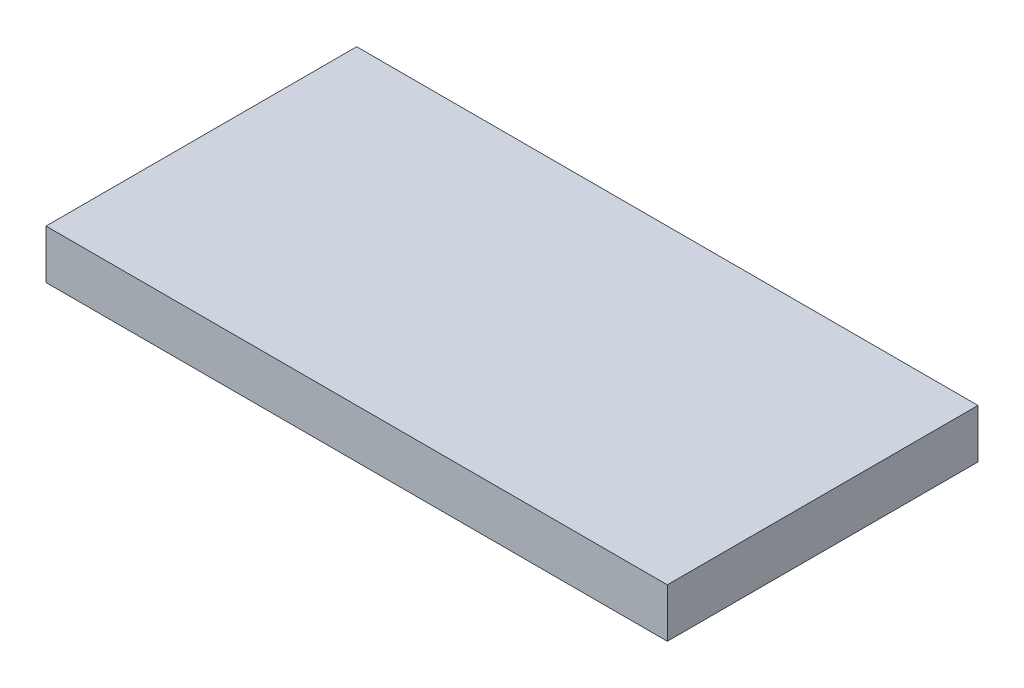
ISO-10303-21;
HEADER;
FILE_DESCRIPTION(('STEP AP214'),'2;1');
FILE_NAME('part.step','',(''),(''),'','','');
FILE_SCHEMA(('AUTOMOTIVE_DESIGN { 1 0 10303 214 1 1 1 1 }'));
ENDSEC;
DATA;
#1=APPLICATION_CONTEXT('core data for automotive mechanical design processes');
#2=APPLICATION_PROTOCOL_DEFINITION('international standard','automotive_design',2000,#1);
#3=PRODUCT_CONTEXT('',#1,'mechanical');
#4=PRODUCT('Part','Part','',(#3));
#5=PRODUCT_RELATED_PRODUCT_CATEGORY('part','',(#4));
#6=PRODUCT_DEFINITION_FORMATION('','',#4);
#7=PRODUCT_DEFINITION_CONTEXT('part definition',#1,'design');
#8=PRODUCT_DEFINITION('design','',#6,#7);
#9=PRODUCT_DEFINITION_SHAPE('','',#8);
#10=(LENGTH_UNIT() NAMED_UNIT(*) SI_UNIT(.MILLI.,.METRE.));
#11=(NAMED_UNIT(*) PLANE_ANGLE_UNIT() SI_UNIT($,.RADIAN.));
#12=(NAMED_UNIT(*) SI_UNIT($,.STERADIAN.) SOLID_ANGLE_UNIT());
#13=UNCERTAINTY_MEASURE_WITH_UNIT(LENGTH_MEASURE(1.E-05),#10,'distance_accuracy_value','');
#14=(GEOMETRIC_REPRESENTATION_CONTEXT(3) GLOBAL_UNCERTAINTY_ASSIGNED_CONTEXT((#13)) GLOBAL_UNIT_ASSIGNED_CONTEXT((#10,
#11,#12)) REPRESENTATION_CONTEXT('',''));
#15=CARTESIAN_POINT('',(0.,0.,0.));
#16=DIRECTION('',(0.,0.,1.));
#17=DIRECTION('',(1.,0.,0.));
#18=AXIS2_PLACEMENT_3D('',#15,#16,#17);
#19=CARTESIAN_POINT('',(0.,4.,0.));
#20=DIRECTION('',(1.,0.,0.));
#21=DIRECTION('',(0.,0.,-1.));
#22=AXIS2_PLACEMENT_3D('',#19,#20,#21);
#23=PLANE('',#22);
#24=DIRECTION('',(0.,0.,1.));
#25=VECTOR('',#24,1.);
#26=CARTESIAN_POINT('',(0.,0.,0.));
#27=LINE('',#26,#25);
#28=CARTESIAN_POINT('',(0.,0.,0.));
#29=VERTEX_POINT('',#28);
#30=CARTESIAN_POINT('',(0.,0.,25.4));
#31=VERTEX_POINT('',#30);
#32=EDGE_CURVE('E96',#29,#31,#27,.T.);
#33=ORIENTED_EDGE('',*,*,#32,.T.);
#34=DIRECTION('',(0.,-1.,0.));
#35=VECTOR('',#34,1.);
#36=CARTESIAN_POINT('',(0.,4.,25.4));
#37=LINE('',#36,#35);
#38=CARTESIAN_POINT('',(0.,4.,25.4));
#39=VERTEX_POINT('',#38);
#40=EDGE_CURVE('E11',#39,#31,#37,.T.);
#41=ORIENTED_EDGE('',*,*,#40,.F.);
#42=DIRECTION('',(0.,0.,1.));
#43=VECTOR('',#42,1.);
#44=CARTESIAN_POINT('',(0.,4.,0.));
#45=LINE('',#44,#43);
#46=CARTESIAN_POINT('',(0.,4.,0.));
#47=VERTEX_POINT('',#46);
#48=EDGE_CURVE('E84',#47,#39,#45,.T.);
#49=ORIENTED_EDGE('',*,*,#48,.F.);
#50=DIRECTION('',(0.,-1.,0.));
#51=VECTOR('',#50,1.);
#52=CARTESIAN_POINT('',(0.,4.,0.));
#53=LINE('',#52,#51);
#54=EDGE_CURVE('E92',#47,#29,#53,.T.);
#55=ORIENTED_EDGE('',*,*,#54,.T.);
#56=EDGE_LOOP('',(#33,#41,#49,#55));
#57=FACE_BOUND('',#56,.T.);
#58=ADVANCED_FACE('F33',(#57),#23,.F.);
#59=CARTESIAN_POINT('',(0.,4.,25.4));
#60=DIRECTION('',(0.,0.,-1.));
#61=DIRECTION('',(-1.,0.,0.));
#62=AXIS2_PLACEMENT_3D('',#59,#60,#61);
#63=PLANE('',#62);
#64=DIRECTION('',(1.,0.,0.));
#65=VECTOR('',#64,1.);
#66=CARTESIAN_POINT('',(0.,0.,25.4));
#67=LINE('',#66,#65);
#68=CARTESIAN_POINT('',(50.8,0.,25.4));
#69=VERTEX_POINT('',#68);
#70=EDGE_CURVE('E88',#31,#69,#67,.T.);
#71=ORIENTED_EDGE('',*,*,#70,.T.);
#72=DIRECTION('',(0.,-1.,0.));
#73=VECTOR('',#72,1.);
#74=CARTESIAN_POINT('',(50.8,4.,25.4));
#75=LINE('',#74,#73);
#76=CARTESIAN_POINT('',(50.8,4.,25.4));
#77=VERTEX_POINT('',#76);
#78=EDGE_CURVE('E41',#77,#69,#75,.T.);
#79=ORIENTED_EDGE('',*,*,#78,.F.);
#80=DIRECTION('',(1.,0.,0.));
#81=VECTOR('',#80,1.);
#82=CARTESIAN_POINT('',(0.,4.,25.4));
#83=LINE('',#82,#81);
#84=EDGE_CURVE('E79',#39,#77,#83,.T.);
#85=ORIENTED_EDGE('',*,*,#84,.F.);
#86=ORIENTED_EDGE('',*,*,#40,.T.);
#87=EDGE_LOOP('',(#71,#79,#85,#86));
#88=FACE_BOUND('',#87,.T.);
#89=ADVANCED_FACE('F87',(#88),#63,.F.);
#90=CARTESIAN_POINT('',(50.8,4.,0.));
#91=DIRECTION('',(-1.,0.,0.));
#92=DIRECTION('',(0.,0.,1.));
#93=AXIS2_PLACEMENT_3D('',#90,#91,#92);
#94=PLANE('',#93);
#95=DIRECTION('',(0.,0.,-1.));
#96=VECTOR('',#95,1.);
#97=CARTESIAN_POINT('',(50.8,0.,0.));
#98=LINE('',#97,#96);
#99=CARTESIAN_POINT('',(50.8,0.,0.));
#100=VERTEX_POINT('',#99);
#101=EDGE_CURVE('E66',#69,#100,#98,.T.);
#102=ORIENTED_EDGE('',*,*,#101,.T.);
#103=DIRECTION('',(0.,-1.,0.));
#104=VECTOR('',#103,1.);
#105=CARTESIAN_POINT('',(50.8,4.,0.));
#106=LINE('',#105,#104);
#107=CARTESIAN_POINT('',(50.8,4.,0.));
#108=VERTEX_POINT('',#107);
#109=EDGE_CURVE('E89',#108,#100,#106,.T.);
#110=ORIENTED_EDGE('',*,*,#109,.F.);
#111=DIRECTION('',(0.,0.,-1.));
#112=VECTOR('',#111,1.);
#113=CARTESIAN_POINT('',(50.8,4.,0.));
#114=LINE('',#113,#112);
#115=EDGE_CURVE('E82',#77,#108,#114,.T.);
#116=ORIENTED_EDGE('',*,*,#115,.F.);
#117=ORIENTED_EDGE('',*,*,#78,.T.);
#118=EDGE_LOOP('',(#102,#110,#116,#117));
#119=FACE_BOUND('',#118,.T.);
#120=ADVANCED_FACE('F90',(#119),#94,.F.);
#121=CARTESIAN_POINT('',(0.,4.,0.));
#122=DIRECTION('',(0.,0.,1.));
#123=DIRECTION('',(1.,0.,0.));
#124=AXIS2_PLACEMENT_3D('',#121,#122,#123);
#125=PLANE('',#124);
#126=DIRECTION('',(-1.,0.,0.));
#127=VECTOR('',#126,1.);
#128=CARTESIAN_POINT('',(0.,0.,0.));
#129=LINE('',#128,#127);
#130=EDGE_CURVE('E72',#100,#29,#129,.T.);
#131=ORIENTED_EDGE('',*,*,#130,.T.);
#132=ORIENTED_EDGE('',*,*,#54,.F.);
#133=DIRECTION('',(-1.,0.,0.));
#134=VECTOR('',#133,1.);
#135=CARTESIAN_POINT('',(0.,4.,0.));
#136=LINE('',#135,#134);
#137=EDGE_CURVE('E49',#108,#47,#136,.T.);
#138=ORIENTED_EDGE('',*,*,#137,.F.);
#139=ORIENTED_EDGE('',*,*,#109,.T.);
#140=EDGE_LOOP('',(#131,#132,#138,#139));
#141=FACE_BOUND('',#140,.T.);
#142=ADVANCED_FACE('F103',(#141),#125,.F.);
#143=CARTESIAN_POINT('',(0.,4.,0.));
#144=DIRECTION('',(0.,1.,0.));
#145=DIRECTION('',(0.,0.,1.));
#146=AXIS2_PLACEMENT_3D('',#143,#144,#145);
#147=PLANE('',#146);
#148=ORIENTED_EDGE('',*,*,#48,.T.);
#149=ORIENTED_EDGE('',*,*,#84,.T.);
#150=ORIENTED_EDGE('',*,*,#115,.T.);
#151=ORIENTED_EDGE('',*,*,#137,.T.);
#152=EDGE_LOOP('',(#148,#149,#150,#151));
#153=FACE_BOUND('',#152,.T.);
#154=ADVANCED_FACE('F80',(#153),#147,.T.);
#155=CARTESIAN_POINT('',(0.,0.,0.));
#156=DIRECTION('',(0.,1.,0.));
#157=DIRECTION('',(0.,0.,1.));
#158=AXIS2_PLACEMENT_3D('',#155,#156,#157);
#159=PLANE('',#158);
#160=ORIENTED_EDGE('',*,*,#32,.F.);
#161=ORIENTED_EDGE('',*,*,#130,.F.);
#162=ORIENTED_EDGE('',*,*,#101,.F.);
#163=ORIENTED_EDGE('',*,*,#70,.F.);
#164=EDGE_LOOP('',(#160,#161,#162,#163));
#165=FACE_BOUND('',#164,.T.);
#166=ADVANCED_FACE('F106',(#165),#159,.F.);
#167=CLOSED_SHELL('',(#58,#89,#120,#142,#154,#166));
#168=MANIFOLD_SOLID_BREP('B2',#167);
#169=ADVANCED_BREP_SHAPE_REPRESENTATION('',(#18,#168),#14);
#170=SHAPE_DEFINITION_REPRESENTATION(#9,#169);
ENDSEC;
END-ISO-10303-21;
